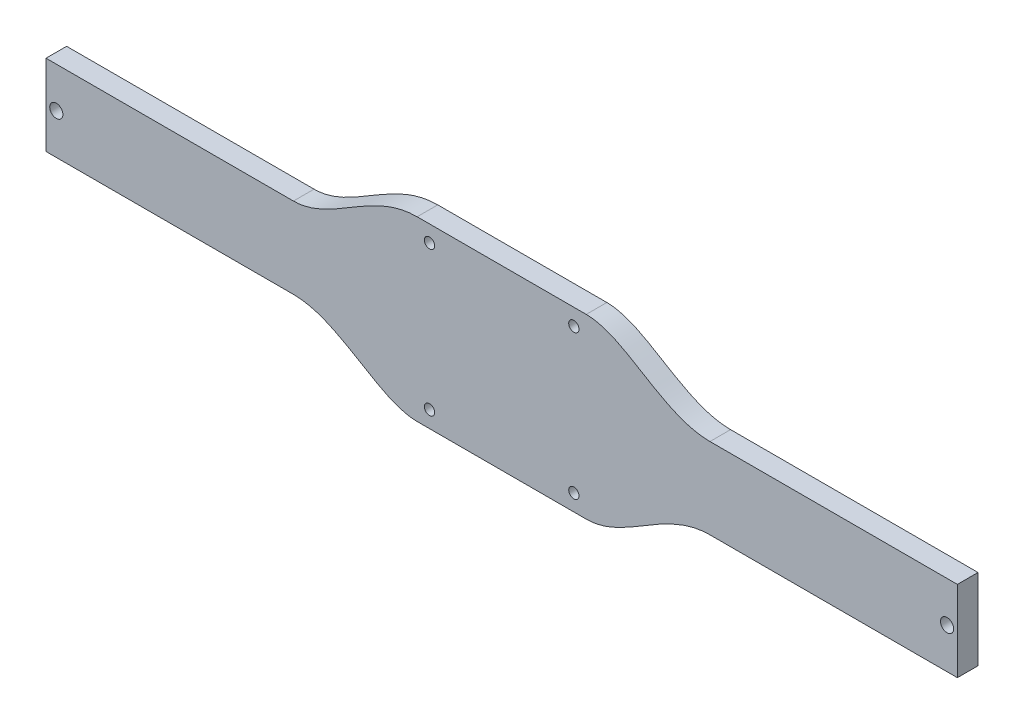
ISO-10303-21;
HEADER;
FILE_DESCRIPTION(('STEP AP214'),'2;1');
FILE_NAME('part.step','',(''),(''),'','','');
FILE_SCHEMA(('AUTOMOTIVE_DESIGN { 1 0 10303 214 1 1 1 1 }'));
ENDSEC;
DATA;
#1=APPLICATION_CONTEXT('core data for automotive mechanical design processes');
#2=APPLICATION_PROTOCOL_DEFINITION('international standard','automotive_design',2000,#1);
#3=PRODUCT_CONTEXT('',#1,'mechanical');
#4=PRODUCT('Part','Part','',(#3));
#5=PRODUCT_RELATED_PRODUCT_CATEGORY('part','',(#4));
#6=PRODUCT_DEFINITION_FORMATION('','',#4);
#7=PRODUCT_DEFINITION_CONTEXT('part definition',#1,'design');
#8=PRODUCT_DEFINITION('design','',#6,#7);
#9=PRODUCT_DEFINITION_SHAPE('','',#8);
#10=(LENGTH_UNIT() NAMED_UNIT(*) SI_UNIT(.MILLI.,.METRE.));
#11=(NAMED_UNIT(*) PLANE_ANGLE_UNIT() SI_UNIT($,.RADIAN.));
#12=(NAMED_UNIT(*) SI_UNIT($,.STERADIAN.) SOLID_ANGLE_UNIT());
#13=UNCERTAINTY_MEASURE_WITH_UNIT(LENGTH_MEASURE(1.E-05),#10,'distance_accuracy_value','');
#14=(GEOMETRIC_REPRESENTATION_CONTEXT(3) GLOBAL_UNCERTAINTY_ASSIGNED_CONTEXT((#13)) GLOBAL_UNIT_ASSIGNED_CONTEXT((#10,
#11,#12)) REPRESENTATION_CONTEXT('',''));
#15=CARTESIAN_POINT('',(0.,0.,0.));
#16=DIRECTION('',(0.,0.,1.));
#17=DIRECTION('',(1.,0.,0.));
#18=AXIS2_PLACEMENT_3D('',#15,#16,#17);
#19=CARTESIAN_POINT('',(-102.200156089066,-2.61277831462619,6.35));
#20=DIRECTION('',(0.,0.,1.));
#21=DIRECTION('',(1.,0.,0.));
#22=AXIS2_PLACEMENT_3D('',#19,#20,#21);
#23=PLANE('',#22);
#24=CARTESIAN_POINT('',(79.1547353944579,17.2627216853738,6.35));
#25=DIRECTION('',(0.,0.,1.));
#26=DIRECTION('',(1.,0.,0.));
#27=AXIS2_PLACEMENT_3D('',#24,#25,#26);
#28=CIRCLE('',#27,2.03199999968805);
#29=CARTESIAN_POINT('',(81.1867353941459,17.2627216853738,6.35));
#30=VERTEX_POINT('',#29);
#31=EDGE_CURVE('E243',#30,#30,#28,.T.);
#32=ORIENTED_EDGE('',*,*,#31,.F.);
#33=EDGE_LOOP('',(#32));
#34=FACE_BOUND('',#33,.T.);
#35=CARTESIAN_POINT('',(-80.2302646055421,-4.96227831462619,6.35));
#36=DIRECTION('',(0.,0.,1.));
#37=DIRECTION('',(1.,0.,0.));
#38=AXIS2_PLACEMENT_3D('',#35,#36,#37);
#39=CIRCLE('',#38,1.5875);
#40=CARTESIAN_POINT('',(-78.6427646055421,-4.96227831462619,6.35));
#41=VERTEX_POINT('',#40);
#42=EDGE_CURVE('E231',#41,#41,#39,.T.);
#43=ORIENTED_EDGE('',*,*,#42,.F.);
#44=EDGE_LOOP('',(#43));
#45=FACE_BOUND('',#44,.T.);
#46=CARTESIAN_POINT('',(-80.2302646055421,39.4877216853738,6.35));
#47=DIRECTION('',(0.,0.,1.));
#48=DIRECTION('',(1.,0.,0.));
#49=AXIS2_PLACEMENT_3D('',#46,#47,#48);
#50=CIRCLE('',#49,1.58749999999999);
#51=CARTESIAN_POINT('',(-78.6427646055422,39.4877216853738,6.35));
#52=VERTEX_POINT('',#51);
#53=EDGE_CURVE('E223',#52,#52,#50,.T.);
#54=ORIENTED_EDGE('',*,*,#53,.F.);
#55=EDGE_LOOP('',(#54));
#56=FACE_BOUND('',#55,.T.);
#57=DIRECTION('',(0.,-1.,0.));
#58=VECTOR('',#57,1.);
#59=CARTESIAN_POINT('',(-198.340264605542,29.7087216853738,6.35));
#60=LINE('',#59,#58);
#61=CARTESIAN_POINT('',(-198.340264605542,29.7087216853738,6.35));
#62=VERTEX_POINT('',#61);
#63=CARTESIAN_POINT('',(-198.340264605542,4.81672168537382,6.35));
#64=VERTEX_POINT('',#63);
#65=EDGE_CURVE('E218',#62,#64,#60,.T.);
#66=ORIENTED_EDGE('',*,*,#65,.T.);
#67=DIRECTION('',(1.,0.,0.));
#68=VECTOR('',#67,1.);
#69=CARTESIAN_POINT('',(-198.340264605542,4.81672168537382,6.35));
#70=LINE('',#69,#68);
#71=CARTESIAN_POINT('',(-122.140264605542,4.81672168537382,6.35));
#72=VERTEX_POINT('',#71);
#73=EDGE_CURVE('E102',#64,#72,#70,.T.);
#74=ORIENTED_EDGE('',*,*,#73,.T.);
#75=CARTESIAN_POINT('',(-122.140264605542,4.81672168537382,6.35));
#76=CARTESIAN_POINT('',(-107.820723209487,4.81672168537391,6.35));
#77=CARTESIAN_POINT('',(-95.9861832909939,-10.0422783146263,6.35));
#78=CARTESIAN_POINT('',(-84.0402646055422,-10.0422783146262,6.35));
#79=B_SPLINE_CURVE_WITH_KNOTS('',3,(#75,#76,#77,#78),.UNSPECIFIED.,.F.,.F.,(4,4),(0.,1.),.UNSPECIFIED.);
#80=CARTESIAN_POINT('',(-84.0402646055422,-10.0422783146262,6.35));
#81=VERTEX_POINT('',#80);
#82=EDGE_CURVE('E209',#72,#81,#79,.T.);
#83=ORIENTED_EDGE('',*,*,#82,.T.);
#84=DIRECTION('',(1.,0.,0.));
#85=VECTOR('',#84,1.);
#86=CARTESIAN_POINT('',(-84.0402646055422,-10.0422783146262,6.35));
#87=LINE('',#86,#85);
#88=CARTESIAN_POINT('',(-31.9702646055421,-10.0422783146262,6.35));
#89=VERTEX_POINT('',#88);
#90=EDGE_CURVE('E189',#81,#89,#87,.T.);
#91=ORIENTED_EDGE('',*,*,#90,.T.);
#92=CARTESIAN_POINT('',(-31.9702646055421,-10.0422783146262,6.35));
#93=CARTESIAN_POINT('',(-19.8459949741253,-10.0422783146262,6.35));
#94=CARTESIAN_POINT('',(-8.14813011694098,4.81672168537381,6.35));
#95=CARTESIAN_POINT('',(6.12973539445788,4.81672168537381,6.35));
#96=B_SPLINE_CURVE_WITH_KNOTS('',3,(#92,#93,#94,#95),.UNSPECIFIED.,.F.,.F.,(4,4),(0.,1.),.UNSPECIFIED.);
#97=CARTESIAN_POINT('',(6.12973539445788,4.81672168537381,6.35));
#98=VERTEX_POINT('',#97);
#99=EDGE_CURVE('E184',#89,#98,#96,.T.);
#100=ORIENTED_EDGE('',*,*,#99,.T.);
#101=DIRECTION('',(1.,0.,0.));
#102=VECTOR('',#101,1.);
#103=CARTESIAN_POINT('',(6.12973539445788,4.81672168537381,6.35));
#104=LINE('',#103,#102);
#105=CARTESIAN_POINT('',(82.3297353944579,4.81672168537381,6.35));
#106=VERTEX_POINT('',#105);
#107=EDGE_CURVE('E182',#98,#106,#104,.T.);
#108=ORIENTED_EDGE('',*,*,#107,.T.);
#109=DIRECTION('',(0.,1.,0.));
#110=VECTOR('',#109,1.);
#111=CARTESIAN_POINT('',(82.3297353944579,29.7087216853738,6.35));
#112=LINE('',#111,#110);
#113=CARTESIAN_POINT('',(82.3297353944579,29.7087216853738,6.35));
#114=VERTEX_POINT('',#113);
#115=EDGE_CURVE('E180',#106,#114,#112,.T.);
#116=ORIENTED_EDGE('',*,*,#115,.T.);
#117=DIRECTION('',(-1.,0.,0.));
#118=VECTOR('',#117,1.);
#119=CARTESIAN_POINT('',(6.12973539445788,29.7087216853738,6.35));
#120=LINE('',#119,#118);
#121=CARTESIAN_POINT('',(6.12973539445788,29.7087216853738,6.35));
#122=VERTEX_POINT('',#121);
#123=EDGE_CURVE('E175',#114,#122,#120,.T.);
#124=ORIENTED_EDGE('',*,*,#123,.T.);
#125=CARTESIAN_POINT('',(6.12973539445788,29.7087216853738,6.35));
#126=CARTESIAN_POINT('',(-8.48247049567898,29.7087216853738,6.35));
#127=CARTESIAN_POINT('',(-19.8459949826375,44.5677216853738,6.35));
#128=CARTESIAN_POINT('',(-31.9702646055421,44.5677216853738,6.35));
#129=B_SPLINE_CURVE_WITH_KNOTS('',3,(#125,#126,#127,#128),.UNSPECIFIED.,.F.,.F.,(4,4),(0.,1.),.UNSPECIFIED.);
#130=CARTESIAN_POINT('',(-31.9702646055421,44.5677216853738,6.35));
#131=VERTEX_POINT('',#130);
#132=EDGE_CURVE('E133',#122,#131,#129,.T.);
#133=ORIENTED_EDGE('',*,*,#132,.T.);
#134=DIRECTION('',(-1.,0.,0.));
#135=VECTOR('',#134,1.);
#136=CARTESIAN_POINT('',(-84.0402646055422,44.5677216853738,6.35));
#137=LINE('',#136,#135);
#138=CARTESIAN_POINT('',(-84.0402646055422,44.5677216853738,6.35));
#139=VERTEX_POINT('',#138);
#140=EDGE_CURVE('E127',#131,#139,#137,.T.);
#141=ORIENTED_EDGE('',*,*,#140,.T.);
#142=CARTESIAN_POINT('',(-84.0402646055422,44.5677216853738,6.35));
#143=CARTESIAN_POINT('',(-98.3598060015969,44.5677216853737,6.35));
#144=CARTESIAN_POINT('',(-110.19434592009,29.7087216853738,6.35));
#145=CARTESIAN_POINT('',(-122.140264605542,29.7087216853738,6.35));
#146=B_SPLINE_CURVE_WITH_KNOTS('',3,(#142,#143,#144,#145),.UNSPECIFIED.,.F.,.F.,(4,4),(0.,1.),.UNSPECIFIED.);
#147=CARTESIAN_POINT('',(-122.140264605542,29.7087216853738,6.35));
#148=VERTEX_POINT('',#147);
#149=EDGE_CURVE('E131',#139,#148,#146,.T.);
#150=ORIENTED_EDGE('',*,*,#149,.T.);
#151=DIRECTION('',(-1.,0.,0.));
#152=VECTOR('',#151,1.);
#153=CARTESIAN_POINT('',(-198.340264605542,29.7087216853738,6.35));
#154=LINE('',#153,#152);
#155=EDGE_CURVE('E47',#148,#62,#154,.T.);
#156=ORIENTED_EDGE('',*,*,#155,.T.);
#157=EDGE_LOOP('',(#66,#74,#83,#91,#100,#108,#116,#124,#133,#141,#150,#156));
#158=FACE_BOUND('',#157,.T.);
#159=CARTESIAN_POINT('',(-35.7802646055421,39.4877216853738,6.35));
#160=DIRECTION('',(0.,0.,1.));
#161=DIRECTION('',(1.,0.,0.));
#162=AXIS2_PLACEMENT_3D('',#159,#160,#161);
#163=CIRCLE('',#162,1.5875);
#164=CARTESIAN_POINT('',(-34.1927646055421,39.4877216853738,6.35));
#165=VERTEX_POINT('',#164);
#166=EDGE_CURVE('E224',#165,#165,#163,.T.);
#167=ORIENTED_EDGE('',*,*,#166,.F.);
#168=EDGE_LOOP('',(#167));
#169=FACE_BOUND('',#168,.T.);
#170=CARTESIAN_POINT('',(-35.7802646055421,-4.96227831462619,6.35));
#171=DIRECTION('',(0.,0.,1.));
#172=DIRECTION('',(1.,0.,0.));
#173=AXIS2_PLACEMENT_3D('',#170,#171,#172);
#174=CIRCLE('',#173,1.5875);
#175=CARTESIAN_POINT('',(-34.1927646055421,-4.96227831462619,6.35));
#176=VERTEX_POINT('',#175);
#177=EDGE_CURVE('E237',#176,#176,#174,.T.);
#178=ORIENTED_EDGE('',*,*,#177,.F.);
#179=EDGE_LOOP('',(#178));
#180=FACE_BOUND('',#179,.T.);
#181=CARTESIAN_POINT('',(-195.165264605542,17.2627216853738,6.35));
#182=DIRECTION('',(0.,0.,1.));
#183=DIRECTION('',(-1.,0.,0.));
#184=AXIS2_PLACEMENT_3D('',#181,#182,#183);
#185=CIRCLE('',#184,2.03199999968802);
#186=CARTESIAN_POINT('',(-197.19726460523,17.2627216853738,6.35));
#187=VERTEX_POINT('',#186);
#188=EDGE_CURVE('E249',#187,#187,#185,.T.);
#189=ORIENTED_EDGE('',*,*,#188,.F.);
#190=EDGE_LOOP('',(#189));
#191=FACE_BOUND('',#190,.T.);
#192=ADVANCED_FACE('F30',(#34,#45,#56,#158,#169,#180,#191),#23,.T.);
#193=CARTESIAN_POINT('',(-102.200156089066,-2.61277831462619,0.));
#194=DIRECTION('',(0.,0.,1.));
#195=DIRECTION('',(1.,0.,0.));
#196=AXIS2_PLACEMENT_3D('',#193,#194,#195);
#197=PLANE('',#196);
#198=CARTESIAN_POINT('',(79.1547353944579,17.2627216853738,0.));
#199=DIRECTION('',(0.,0.,1.));
#200=DIRECTION('',(1.,0.,0.));
#201=AXIS2_PLACEMENT_3D('',#198,#199,#200);
#202=CIRCLE('',#201,2.03199999968805);
#203=CARTESIAN_POINT('',(81.1867353941459,17.2627216853738,0.));
#204=VERTEX_POINT('',#203);
#205=EDGE_CURVE('E246',#204,#204,#202,.T.);
#206=ORIENTED_EDGE('',*,*,#205,.T.);
#207=EDGE_LOOP('',(#206));
#208=FACE_BOUND('',#207,.T.);
#209=CARTESIAN_POINT('',(-80.2302646055421,-4.96227831462619,0.));
#210=DIRECTION('',(0.,0.,1.));
#211=DIRECTION('',(1.,0.,0.));
#212=AXIS2_PLACEMENT_3D('',#209,#210,#211);
#213=CIRCLE('',#212,1.5875);
#214=CARTESIAN_POINT('',(-78.6427646055421,-4.96227831462619,0.));
#215=VERTEX_POINT('',#214);
#216=EDGE_CURVE('E234',#215,#215,#213,.T.);
#217=ORIENTED_EDGE('',*,*,#216,.T.);
#218=EDGE_LOOP('',(#217));
#219=FACE_BOUND('',#218,.T.);
#220=CARTESIAN_POINT('',(-80.2302646055421,39.4877216853738,0.));
#221=DIRECTION('',(0.,0.,1.));
#222=DIRECTION('',(1.,0.,0.));
#223=AXIS2_PLACEMENT_3D('',#220,#221,#222);
#224=CIRCLE('',#223,1.58749999999999);
#225=CARTESIAN_POINT('',(-78.6427646055422,39.4877216853738,0.));
#226=VERTEX_POINT('',#225);
#227=EDGE_CURVE('E220',#226,#226,#224,.T.);
#228=ORIENTED_EDGE('',*,*,#227,.T.);
#229=EDGE_LOOP('',(#228));
#230=FACE_BOUND('',#229,.T.);
#231=DIRECTION('',(0.,-1.,0.));
#232=VECTOR('',#231,1.);
#233=CARTESIAN_POINT('',(-198.340264605542,29.7087216853738,0.));
#234=LINE('',#233,#232);
#235=CARTESIAN_POINT('',(-198.340264605542,29.7087216853738,0.));
#236=VERTEX_POINT('',#235);
#237=CARTESIAN_POINT('',(-198.340264605542,4.81672168537382,0.));
#238=VERTEX_POINT('',#237);
#239=EDGE_CURVE('E227',#236,#238,#234,.T.);
#240=ORIENTED_EDGE('',*,*,#239,.F.);
#241=DIRECTION('',(-1.,0.,0.));
#242=VECTOR('',#241,1.);
#243=CARTESIAN_POINT('',(-198.340264605542,29.7087216853738,0.));
#244=LINE('',#243,#242);
#245=CARTESIAN_POINT('',(-122.140264605542,29.7087216853738,0.));
#246=VERTEX_POINT('',#245);
#247=EDGE_CURVE('E94',#246,#236,#244,.T.);
#248=ORIENTED_EDGE('',*,*,#247,.F.);
#249=CARTESIAN_POINT('',(-84.0402646055422,44.5677216853738,0.));
#250=CARTESIAN_POINT('',(-98.3598060015969,44.5677216853737,0.));
#251=CARTESIAN_POINT('',(-110.19434592009,29.7087216853738,0.));
#252=CARTESIAN_POINT('',(-122.140264605542,29.7087216853738,0.));
#253=B_SPLINE_CURVE_WITH_KNOTS('',3,(#249,#250,#251,#252),.UNSPECIFIED.,.F.,.F.,(4,4),(0.,1.),.UNSPECIFIED.);
#254=CARTESIAN_POINT('',(-84.0402646055422,44.5677216853738,0.));
#255=VERTEX_POINT('',#254);
#256=EDGE_CURVE('E88',#255,#246,#253,.T.);
#257=ORIENTED_EDGE('',*,*,#256,.F.);
#258=DIRECTION('',(-1.,0.,0.));
#259=VECTOR('',#258,1.);
#260=CARTESIAN_POINT('',(-84.0402646055422,44.5677216853738,0.));
#261=LINE('',#260,#259);
#262=CARTESIAN_POINT('',(-31.9702646055421,44.5677216853738,0.));
#263=VERTEX_POINT('',#262);
#264=EDGE_CURVE('E141',#263,#255,#261,.T.);
#265=ORIENTED_EDGE('',*,*,#264,.F.);
#266=CARTESIAN_POINT('',(6.12973539445788,29.7087216853738,0.));
#267=CARTESIAN_POINT('',(-8.48247049567898,29.7087216853738,0.));
#268=CARTESIAN_POINT('',(-19.8459949826375,44.5677216853738,0.));
#269=CARTESIAN_POINT('',(-31.9702646055421,44.5677216853738,0.));
#270=B_SPLINE_CURVE_WITH_KNOTS('',3,(#266,#267,#268,#269),.UNSPECIFIED.,.F.,.F.,(4,4),(0.,1.),.UNSPECIFIED.);
#271=CARTESIAN_POINT('',(6.12973539445788,29.7087216853738,0.));
#272=VERTEX_POINT('',#271);
#273=EDGE_CURVE('E452',#272,#263,#270,.T.);
#274=ORIENTED_EDGE('',*,*,#273,.F.);
#275=DIRECTION('',(-1.,0.,0.));
#276=VECTOR('',#275,1.);
#277=CARTESIAN_POINT('',(6.12973539445788,29.7087216853738,0.));
#278=LINE('',#277,#276);
#279=CARTESIAN_POINT('',(82.3297353944579,29.7087216853738,0.));
#280=VERTEX_POINT('',#279);
#281=EDGE_CURVE('E450',#280,#272,#278,.T.);
#282=ORIENTED_EDGE('',*,*,#281,.F.);
#283=DIRECTION('',(0.,1.,0.));
#284=VECTOR('',#283,1.);
#285=CARTESIAN_POINT('',(82.3297353944579,29.7087216853738,0.));
#286=LINE('',#285,#284);
#287=CARTESIAN_POINT('',(82.3297353944579,4.81672168537381,0.));
#288=VERTEX_POINT('',#287);
#289=EDGE_CURVE('E448',#288,#280,#286,.T.);
#290=ORIENTED_EDGE('',*,*,#289,.F.);
#291=DIRECTION('',(1.,0.,0.));
#292=VECTOR('',#291,1.);
#293=CARTESIAN_POINT('',(6.12973539445788,4.81672168537381,0.));
#294=LINE('',#293,#292);
#295=CARTESIAN_POINT('',(6.12973539445788,4.81672168537381,0.));
#296=VERTEX_POINT('',#295);
#297=EDGE_CURVE('E443',#296,#288,#294,.T.);
#298=ORIENTED_EDGE('',*,*,#297,.F.);
#299=CARTESIAN_POINT('',(-31.9702646055421,-10.0422783146262,0.));
#300=CARTESIAN_POINT('',(-19.8459949741253,-10.0422783146262,0.));
#301=CARTESIAN_POINT('',(-8.14813011694098,4.81672168537381,0.));
#302=CARTESIAN_POINT('',(6.12973539445788,4.81672168537381,0.));
#303=B_SPLINE_CURVE_WITH_KNOTS('',3,(#299,#300,#301,#302),.UNSPECIFIED.,.F.,.F.,(4,4),(0.,1.),.UNSPECIFIED.);
#304=CARTESIAN_POINT('',(-31.9702646055421,-10.0422783146262,0.));
#305=VERTEX_POINT('',#304);
#306=EDGE_CURVE('E439',#305,#296,#303,.T.);
#307=ORIENTED_EDGE('',*,*,#306,.F.);
#308=DIRECTION('',(1.,0.,0.));
#309=VECTOR('',#308,1.);
#310=CARTESIAN_POINT('',(-84.0402646055422,-10.0422783146262,0.));
#311=LINE('',#310,#309);
#312=CARTESIAN_POINT('',(-84.0402646055422,-10.0422783146262,0.));
#313=VERTEX_POINT('',#312);
#314=EDGE_CURVE('E434',#313,#305,#311,.T.);
#315=ORIENTED_EDGE('',*,*,#314,.F.);
#316=CARTESIAN_POINT('',(-122.140264605542,4.81672168537382,0.));
#317=CARTESIAN_POINT('',(-107.820723209487,4.81672168537391,0.));
#318=CARTESIAN_POINT('',(-95.9861832909939,-10.0422783146263,0.));
#319=CARTESIAN_POINT('',(-84.0402646055422,-10.0422783146262,0.));
#320=B_SPLINE_CURVE_WITH_KNOTS('',3,(#316,#317,#318,#319),.UNSPECIFIED.,.F.,.F.,(4,4),(0.,1.),.UNSPECIFIED.);
#321=CARTESIAN_POINT('',(-122.140264605542,4.81672168537382,0.));
#322=VERTEX_POINT('',#321);
#323=EDGE_CURVE('E428',#322,#313,#320,.T.);
#324=ORIENTED_EDGE('',*,*,#323,.F.);
#325=DIRECTION('',(1.,0.,0.));
#326=VECTOR('',#325,1.);
#327=CARTESIAN_POINT('',(-198.340264605542,4.81672168537382,0.));
#328=LINE('',#327,#326);
#329=EDGE_CURVE('E427',#238,#322,#328,.T.);
#330=ORIENTED_EDGE('',*,*,#329,.F.);
#331=EDGE_LOOP('',(#240,#248,#257,#265,#274,#282,#290,#298,#307,#315,#324,#330));
#332=FACE_BOUND('',#331,.T.);
#333=CARTESIAN_POINT('',(-35.7802646055421,39.4877216853738,0.));
#334=DIRECTION('',(0.,0.,1.));
#335=DIRECTION('',(1.,0.,0.));
#336=AXIS2_PLACEMENT_3D('',#333,#334,#335);
#337=CIRCLE('',#336,1.5875);
#338=CARTESIAN_POINT('',(-34.1927646055421,39.4877216853738,0.));
#339=VERTEX_POINT('',#338);
#340=EDGE_CURVE('E228',#339,#339,#337,.T.);
#341=ORIENTED_EDGE('',*,*,#340,.T.);
#342=EDGE_LOOP('',(#341));
#343=FACE_BOUND('',#342,.T.);
#344=CARTESIAN_POINT('',(-35.7802646055421,-4.96227831462619,0.));
#345=DIRECTION('',(0.,0.,1.));
#346=DIRECTION('',(1.,0.,0.));
#347=AXIS2_PLACEMENT_3D('',#344,#345,#346);
#348=CIRCLE('',#347,1.5875);
#349=CARTESIAN_POINT('',(-34.1927646055421,-4.96227831462619,0.));
#350=VERTEX_POINT('',#349);
#351=EDGE_CURVE('E240',#350,#350,#348,.T.);
#352=ORIENTED_EDGE('',*,*,#351,.T.);
#353=EDGE_LOOP('',(#352));
#354=FACE_BOUND('',#353,.T.);
#355=CARTESIAN_POINT('',(-195.165264605542,17.2627216853738,0.));
#356=DIRECTION('',(0.,0.,1.));
#357=DIRECTION('',(-1.,0.,0.));
#358=AXIS2_PLACEMENT_3D('',#355,#356,#357);
#359=CIRCLE('',#358,2.03199999968802);
#360=CARTESIAN_POINT('',(-197.19726460523,17.2627216853738,0.));
#361=VERTEX_POINT('',#360);
#362=EDGE_CURVE('E252',#361,#361,#359,.T.);
#363=ORIENTED_EDGE('',*,*,#362,.T.);
#364=EDGE_LOOP('',(#363));
#365=FACE_BOUND('',#364,.T.);
#366=ADVANCED_FACE('F262',(#208,#219,#230,#332,#343,#354,#365),#197,.F.);
#367=CARTESIAN_POINT('',(-198.340264605542,29.7087216853738,6.35));
#368=DIRECTION('',(1.,0.,0.));
#369=DIRECTION('',(0.,0.,-1.));
#370=AXIS2_PLACEMENT_3D('',#367,#368,#369);
#371=PLANE('',#370);
#372=ORIENTED_EDGE('',*,*,#239,.T.);
#373=DIRECTION('',(0.,0.,-1.));
#374=VECTOR('',#373,1.);
#375=CARTESIAN_POINT('',(-198.340264605542,4.81672168537382,6.35));
#376=LINE('',#375,#374);
#377=EDGE_CURVE('E11',#64,#238,#376,.T.);
#378=ORIENTED_EDGE('',*,*,#377,.F.);
#379=ORIENTED_EDGE('',*,*,#65,.F.);
#380=DIRECTION('',(0.,0.,-1.));
#381=VECTOR('',#380,1.);
#382=CARTESIAN_POINT('',(-198.340264605542,29.7087216853738,6.35));
#383=LINE('',#382,#381);
#384=EDGE_CURVE('E147',#62,#236,#383,.T.);
#385=ORIENTED_EDGE('',*,*,#384,.T.);
#386=EDGE_LOOP('',(#372,#378,#379,#385));
#387=FACE_BOUND('',#386,.T.);
#388=ADVANCED_FACE('F32',(#387),#371,.F.);
#389=CARTESIAN_POINT('',(-198.340264605542,4.81672168537382,6.35));
#390=DIRECTION('',(0.,1.,0.));
#391=DIRECTION('',(-1.,0.,0.));
#392=AXIS2_PLACEMENT_3D('',#389,#390,#391);
#393=PLANE('',#392);
#394=ORIENTED_EDGE('',*,*,#329,.T.);
#395=DIRECTION('',(0.,0.,-1.));
#396=VECTOR('',#395,1.);
#397=CARTESIAN_POINT('',(-122.140264605542,4.81672168537382,6.35));
#398=LINE('',#397,#396);
#399=EDGE_CURVE('E39',#72,#322,#398,.T.);
#400=ORIENTED_EDGE('',*,*,#399,.F.);
#401=ORIENTED_EDGE('',*,*,#73,.F.);
#402=ORIENTED_EDGE('',*,*,#377,.T.);
#403=EDGE_LOOP('',(#394,#400,#401,#402));
#404=FACE_BOUND('',#403,.T.);
#405=ADVANCED_FACE('F207',(#404),#393,.F.);
#406=DIRECTION('',(0.,0.,-1.));
#407=VECTOR('',#406,1.);
#408=SURFACE_OF_LINEAR_EXTRUSION('',#79,#407);
#409=ORIENTED_EDGE('',*,*,#323,.T.);
#410=DIRECTION('',(0.,0.,-1.));
#411=VECTOR('',#410,1.);
#412=CARTESIAN_POINT('',(-84.0402646055422,-10.0422783146262,6.35));
#413=LINE('',#412,#411);
#414=EDGE_CURVE('E485',#81,#313,#413,.T.);
#415=ORIENTED_EDGE('',*,*,#414,.F.);
#416=ORIENTED_EDGE('',*,*,#82,.F.);
#417=ORIENTED_EDGE('',*,*,#399,.T.);
#418=EDGE_LOOP('',(#409,#415,#416,#417));
#419=FACE_BOUND('',#418,.T.);
#420=ADVANCED_FACE('F204',(#419),#408,.F.);
#421=CARTESIAN_POINT('',(-84.0402646055422,-10.0422783146262,6.35));
#422=DIRECTION('',(0.,1.,0.));
#423=DIRECTION('',(0.,0.,1.));
#424=AXIS2_PLACEMENT_3D('',#421,#422,#423);
#425=PLANE('',#424);
#426=ORIENTED_EDGE('',*,*,#314,.T.);
#427=DIRECTION('',(0.,0.,-1.));
#428=VECTOR('',#427,1.);
#429=CARTESIAN_POINT('',(-31.9702646055421,-10.0422783146262,6.35));
#430=LINE('',#429,#428);
#431=EDGE_CURVE('E482',#89,#305,#430,.T.);
#432=ORIENTED_EDGE('',*,*,#431,.F.);
#433=ORIENTED_EDGE('',*,*,#90,.F.);
#434=ORIENTED_EDGE('',*,*,#414,.T.);
#435=EDGE_LOOP('',(#426,#432,#433,#434));
#436=FACE_BOUND('',#435,.T.);
#437=ADVANCED_FACE('F200',(#436),#425,.F.);
#438=DIRECTION('',(0.,0.,-1.));
#439=VECTOR('',#438,1.);
#440=SURFACE_OF_LINEAR_EXTRUSION('',#96,#439);
#441=ORIENTED_EDGE('',*,*,#306,.T.);
#442=DIRECTION('',(0.,0.,-1.));
#443=VECTOR('',#442,1.);
#444=CARTESIAN_POINT('',(6.12973539445788,4.81672168537381,6.35));
#445=LINE('',#444,#443);
#446=EDGE_CURVE('E479',#98,#296,#445,.T.);
#447=ORIENTED_EDGE('',*,*,#446,.F.);
#448=ORIENTED_EDGE('',*,*,#99,.F.);
#449=ORIENTED_EDGE('',*,*,#431,.T.);
#450=EDGE_LOOP('',(#441,#447,#448,#449));
#451=FACE_BOUND('',#450,.T.);
#452=ADVANCED_FACE('F195',(#451),#440,.F.);
#453=CARTESIAN_POINT('',(6.12973539445788,4.81672168537381,6.35));
#454=DIRECTION('',(0.,1.,0.));
#455=DIRECTION('',(-1.,0.,0.));
#456=AXIS2_PLACEMENT_3D('',#453,#454,#455);
#457=PLANE('',#456);
#458=ORIENTED_EDGE('',*,*,#297,.T.);
#459=DIRECTION('',(0.,0.,-1.));
#460=VECTOR('',#459,1.);
#461=CARTESIAN_POINT('',(82.3297353944579,4.81672168537381,6.35));
#462=LINE('',#461,#460);
#463=EDGE_CURVE('E476',#106,#288,#462,.T.);
#464=ORIENTED_EDGE('',*,*,#463,.F.);
#465=ORIENTED_EDGE('',*,*,#107,.F.);
#466=ORIENTED_EDGE('',*,*,#446,.T.);
#467=EDGE_LOOP('',(#458,#464,#465,#466));
#468=FACE_BOUND('',#467,.T.);
#469=ADVANCED_FACE('F199',(#468),#457,.F.);
#470=CARTESIAN_POINT('',(82.3297353944579,29.7087216853738,6.35));
#471=DIRECTION('',(-1.,0.,0.));
#472=DIRECTION('',(0.,0.,1.));
#473=AXIS2_PLACEMENT_3D('',#470,#471,#472);
#474=PLANE('',#473);
#475=ORIENTED_EDGE('',*,*,#289,.T.);
#476=DIRECTION('',(0.,0.,-1.));
#477=VECTOR('',#476,1.);
#478=CARTESIAN_POINT('',(82.3297353944579,29.7087216853738,6.35));
#479=LINE('',#478,#477);
#480=EDGE_CURVE('E473',#114,#280,#479,.T.);
#481=ORIENTED_EDGE('',*,*,#480,.F.);
#482=ORIENTED_EDGE('',*,*,#115,.F.);
#483=ORIENTED_EDGE('',*,*,#463,.T.);
#484=EDGE_LOOP('',(#475,#481,#482,#483));
#485=FACE_BOUND('',#484,.T.);
#486=ADVANCED_FACE('F338',(#485),#474,.F.);
#487=CARTESIAN_POINT('',(6.12973539445788,29.7087216853738,6.35));
#488=DIRECTION('',(0.,-1.,0.));
#489=DIRECTION('',(0.,0.,-1.));
#490=AXIS2_PLACEMENT_3D('',#487,#488,#489);
#491=PLANE('',#490);
#492=ORIENTED_EDGE('',*,*,#281,.T.);
#493=DIRECTION('',(0.,0.,-1.));
#494=VECTOR('',#493,1.);
#495=CARTESIAN_POINT('',(6.12973539445788,29.7087216853738,6.35));
#496=LINE('',#495,#494);
#497=EDGE_CURVE('E470',#122,#272,#496,.T.);
#498=ORIENTED_EDGE('',*,*,#497,.F.);
#499=ORIENTED_EDGE('',*,*,#123,.F.);
#500=ORIENTED_EDGE('',*,*,#480,.T.);
#501=EDGE_LOOP('',(#492,#498,#499,#500));
#502=FACE_BOUND('',#501,.T.);
#503=ADVANCED_FACE('F168',(#502),#491,.F.);
#504=DIRECTION('',(0.,0.,-1.));
#505=VECTOR('',#504,1.);
#506=SURFACE_OF_LINEAR_EXTRUSION('',#129,#505);
#507=ORIENTED_EDGE('',*,*,#273,.T.);
#508=DIRECTION('',(0.,0.,-1.));
#509=VECTOR('',#508,1.);
#510=CARTESIAN_POINT('',(-31.9702646055421,44.5677216853738,6.35));
#511=LINE('',#510,#509);
#512=EDGE_CURVE('E142',#131,#263,#511,.T.);
#513=ORIENTED_EDGE('',*,*,#512,.F.);
#514=ORIENTED_EDGE('',*,*,#132,.F.);
#515=ORIENTED_EDGE('',*,*,#497,.T.);
#516=EDGE_LOOP('',(#507,#513,#514,#515));
#517=FACE_BOUND('',#516,.T.);
#518=ADVANCED_FACE('F165',(#517),#506,.F.);
#519=CARTESIAN_POINT('',(-84.0402646055422,44.5677216853738,6.35));
#520=DIRECTION('',(0.,-1.,0.));
#521=DIRECTION('',(0.,0.,-1.));
#522=AXIS2_PLACEMENT_3D('',#519,#520,#521);
#523=PLANE('',#522);
#524=ORIENTED_EDGE('',*,*,#264,.T.);
#525=DIRECTION('',(0.,0.,-1.));
#526=VECTOR('',#525,1.);
#527=CARTESIAN_POINT('',(-84.0402646055422,44.5677216853738,6.35));
#528=LINE('',#527,#526);
#529=EDGE_CURVE('E138',#139,#255,#528,.T.);
#530=ORIENTED_EDGE('',*,*,#529,.F.);
#531=ORIENTED_EDGE('',*,*,#140,.F.);
#532=ORIENTED_EDGE('',*,*,#512,.T.);
#533=EDGE_LOOP('',(#524,#530,#531,#532));
#534=FACE_BOUND('',#533,.T.);
#535=ADVANCED_FACE('F139',(#534),#523,.F.);
#536=DIRECTION('',(0.,0.,-1.));
#537=VECTOR('',#536,1.);
#538=SURFACE_OF_LINEAR_EXTRUSION('',#146,#537);
#539=ORIENTED_EDGE('',*,*,#256,.T.);
#540=DIRECTION('',(0.,0.,-1.));
#541=VECTOR('',#540,1.);
#542=CARTESIAN_POINT('',(-122.140264605542,29.7087216853738,6.35));
#543=LINE('',#542,#541);
#544=EDGE_CURVE('E143',#148,#246,#543,.T.);
#545=ORIENTED_EDGE('',*,*,#544,.F.);
#546=ORIENTED_EDGE('',*,*,#149,.F.);
#547=ORIENTED_EDGE('',*,*,#529,.T.);
#548=EDGE_LOOP('',(#539,#545,#546,#547));
#549=FACE_BOUND('',#548,.T.);
#550=ADVANCED_FACE('F145',(#549),#538,.F.);
#551=CARTESIAN_POINT('',(-198.340264605542,29.7087216853738,6.35));
#552=DIRECTION('',(0.,-1.,0.));
#553=DIRECTION('',(0.,0.,-1.));
#554=AXIS2_PLACEMENT_3D('',#551,#552,#553);
#555=PLANE('',#554);
#556=ORIENTED_EDGE('',*,*,#247,.T.);
#557=ORIENTED_EDGE('',*,*,#384,.F.);
#558=ORIENTED_EDGE('',*,*,#155,.F.);
#559=ORIENTED_EDGE('',*,*,#544,.T.);
#560=EDGE_LOOP('',(#556,#557,#558,#559));
#561=FACE_BOUND('',#560,.T.);
#562=ADVANCED_FACE('F161',(#561),#555,.F.);
#563=CARTESIAN_POINT('',(-80.2302646055421,39.4877216853738,6.35));
#564=DIRECTION('',(0.,0.,-1.));
#565=DIRECTION('',(-1.,0.,0.));
#566=AXIS2_PLACEMENT_3D('',#563,#564,#565);
#567=CYLINDRICAL_SURFACE('',#566,1.58749999999999);
#568=ORIENTED_EDGE('',*,*,#53,.T.);
#569=EDGE_LOOP('',(#568));
#570=FACE_BOUND('',#569,.T.);
#571=ORIENTED_EDGE('',*,*,#227,.F.);
#572=EDGE_LOOP('',(#571));
#573=FACE_BOUND('',#572,.T.);
#574=ADVANCED_FACE('F272',(#570,#573),#567,.F.);
#575=CARTESIAN_POINT('',(-35.7802646055421,39.4877216853738,6.35));
#576=DIRECTION('',(0.,0.,-1.));
#577=DIRECTION('',(-1.,0.,0.));
#578=AXIS2_PLACEMENT_3D('',#575,#576,#577);
#579=CYLINDRICAL_SURFACE('',#578,1.5875);
#580=ORIENTED_EDGE('',*,*,#166,.T.);
#581=EDGE_LOOP('',(#580));
#582=FACE_BOUND('',#581,.T.);
#583=ORIENTED_EDGE('',*,*,#340,.F.);
#584=EDGE_LOOP('',(#583));
#585=FACE_BOUND('',#584,.T.);
#586=ADVANCED_FACE('F275',(#582,#585),#579,.F.);
#587=CARTESIAN_POINT('',(-80.2302646055421,-4.96227831462619,6.35));
#588=DIRECTION('',(0.,0.,-1.));
#589=DIRECTION('',(-1.,0.,0.));
#590=AXIS2_PLACEMENT_3D('',#587,#588,#589);
#591=CYLINDRICAL_SURFACE('',#590,1.5875);
#592=ORIENTED_EDGE('',*,*,#42,.T.);
#593=EDGE_LOOP('',(#592));
#594=FACE_BOUND('',#593,.T.);
#595=ORIENTED_EDGE('',*,*,#216,.F.);
#596=EDGE_LOOP('',(#595));
#597=FACE_BOUND('',#596,.T.);
#598=ADVANCED_FACE('F279',(#594,#597),#591,.F.);
#599=CARTESIAN_POINT('',(-35.7802646055421,-4.96227831462619,6.35));
#600=DIRECTION('',(0.,0.,-1.));
#601=DIRECTION('',(-1.,0.,0.));
#602=AXIS2_PLACEMENT_3D('',#599,#600,#601);
#603=CYLINDRICAL_SURFACE('',#602,1.5875);
#604=ORIENTED_EDGE('',*,*,#177,.T.);
#605=EDGE_LOOP('',(#604));
#606=FACE_BOUND('',#605,.T.);
#607=ORIENTED_EDGE('',*,*,#351,.F.);
#608=EDGE_LOOP('',(#607));
#609=FACE_BOUND('',#608,.T.);
#610=ADVANCED_FACE('F283',(#606,#609),#603,.F.);
#611=CARTESIAN_POINT('',(79.1547353944579,17.2627216853738,6.35));
#612=DIRECTION('',(0.,0.,-1.));
#613=DIRECTION('',(-1.,0.,0.));
#614=AXIS2_PLACEMENT_3D('',#611,#612,#613);
#615=CYLINDRICAL_SURFACE('',#614,2.03199999968805);
#616=ORIENTED_EDGE('',*,*,#31,.T.);
#617=EDGE_LOOP('',(#616));
#618=FACE_BOUND('',#617,.T.);
#619=ORIENTED_EDGE('',*,*,#205,.F.);
#620=EDGE_LOOP('',(#619));
#621=FACE_BOUND('',#620,.T.);
#622=ADVANCED_FACE('F287',(#618,#621),#615,.F.);
#623=CARTESIAN_POINT('',(-195.165264605542,17.2627216853738,6.35));
#624=DIRECTION('',(0.,0.,-1.));
#625=DIRECTION('',(-1.,0.,0.));
#626=AXIS2_PLACEMENT_3D('',#623,#624,#625);
#627=CYLINDRICAL_SURFACE('',#626,2.03199999968802);
#628=ORIENTED_EDGE('',*,*,#188,.T.);
#629=EDGE_LOOP('',(#628));
#630=FACE_BOUND('',#629,.T.);
#631=ORIENTED_EDGE('',*,*,#362,.F.);
#632=EDGE_LOOP('',(#631));
#633=FACE_BOUND('',#632,.T.);
#634=ADVANCED_FACE('F258',(#630,#633),#627,.F.);
#635=CLOSED_SHELL('',(#192,#366,#388,#405,#420,#437,#452,#469,#486,#503,#518,#535,#550,#562,
#574,#586,#598,#610,#622,#634));
#636=MANIFOLD_SOLID_BREP('B2',#635);
#637=ADVANCED_BREP_SHAPE_REPRESENTATION('',(#18,#636),#14);
#638=SHAPE_DEFINITION_REPRESENTATION(#9,#637);
ENDSEC;
END-ISO-10303-21;
